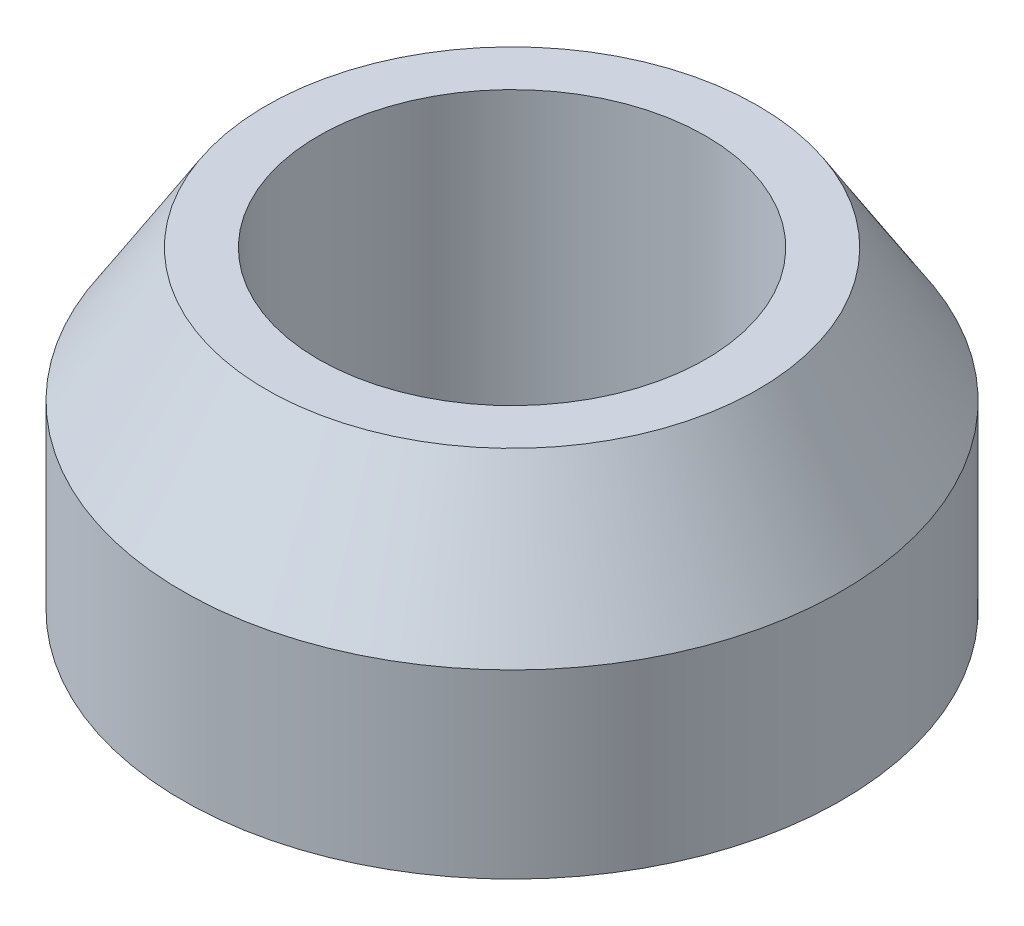
ISO-10303-21;
HEADER;
FILE_DESCRIPTION(('STEP AP214'),'2;1');
FILE_NAME('part.step','',(''),(''),'','','');
FILE_SCHEMA(('AUTOMOTIVE_DESIGN { 1 0 10303 214 1 1 1 1 }'));
ENDSEC;
DATA;
#1=APPLICATION_CONTEXT('core data for automotive mechanical design processes');
#2=APPLICATION_PROTOCOL_DEFINITION('international standard','automotive_design',2000,#1);
#3=PRODUCT_CONTEXT('',#1,'mechanical');
#4=PRODUCT('Part','Part','',(#3));
#5=PRODUCT_RELATED_PRODUCT_CATEGORY('part','',(#4));
#6=PRODUCT_DEFINITION_FORMATION('','',#4);
#7=PRODUCT_DEFINITION_CONTEXT('part definition',#1,'design');
#8=PRODUCT_DEFINITION('design','',#6,#7);
#9=PRODUCT_DEFINITION_SHAPE('','',#8);
#10=(LENGTH_UNIT() NAMED_UNIT(*) SI_UNIT(.MILLI.,.METRE.));
#11=(NAMED_UNIT(*) PLANE_ANGLE_UNIT() SI_UNIT($,.RADIAN.));
#12=(NAMED_UNIT(*) SI_UNIT($,.STERADIAN.) SOLID_ANGLE_UNIT());
#13=UNCERTAINTY_MEASURE_WITH_UNIT(LENGTH_MEASURE(1.E-05),#10,'distance_accuracy_value','');
#14=(GEOMETRIC_REPRESENTATION_CONTEXT(3) GLOBAL_UNCERTAINTY_ASSIGNED_CONTEXT((#13)) GLOBAL_UNIT_ASSIGNED_CONTEXT((#10,
#11,#12)) REPRESENTATION_CONTEXT('',''));
#15=CARTESIAN_POINT('',(0.,0.,0.));
#16=DIRECTION('',(0.,0.,1.));
#17=DIRECTION('',(1.,0.,0.));
#18=AXIS2_PLACEMENT_3D('',#15,#16,#17);
#19=CARTESIAN_POINT('',(1.85,0.,0.));
#20=DIRECTION('',(0.,-1.,0.));
#21=DIRECTION('',(0.,0.,-1.));
#22=AXIS2_PLACEMENT_3D('',#19,#20,#21);
#23=PLANE('',#22);
#24=CARTESIAN_POINT('',(0.,0.,0.));
#25=DIRECTION('',(0.,-1.,0.));
#26=DIRECTION('',(0.,0.,-1.));
#27=AXIS2_PLACEMENT_3D('',#24,#25,#26);
#28=CIRCLE('',#27,3.15);
#29=CARTESIAN_POINT('',(0.,0.,-3.15));
#30=VERTEX_POINT('',#29);
#31=EDGE_CURVE('E10',#30,#30,#28,.T.);
#32=ORIENTED_EDGE('',*,*,#31,.T.);
#33=EDGE_LOOP('',(#32));
#34=FACE_BOUND('',#33,.T.);
#35=CARTESIAN_POINT('',(0.,0.,0.));
#36=DIRECTION('',(0.,-1.,0.));
#37=DIRECTION('',(0.,0.,-1.));
#38=AXIS2_PLACEMENT_3D('',#35,#36,#37);
#39=CIRCLE('',#38,1.85);
#40=CARTESIAN_POINT('',(0.,0.,-1.85));
#41=VERTEX_POINT('',#40);
#42=EDGE_CURVE('E56',#41,#41,#39,.T.);
#43=ORIENTED_EDGE('',*,*,#42,.F.);
#44=EDGE_LOOP('',(#43));
#45=FACE_BOUND('',#44,.T.);
#46=ADVANCED_FACE('F37',(#34,#45),#23,.T.);
#47=CARTESIAN_POINT('',(0.,0.,0.));
#48=DIRECTION('',(0.,-1.,0.));
#49=DIRECTION('',(0.,0.,-1.));
#50=AXIS2_PLACEMENT_3D('',#47,#48,#49);
#51=CYLINDRICAL_SURFACE('',#50,3.15);
#52=CARTESIAN_POINT('',(0.,1.73114224595505,0.));
#53=DIRECTION('',(0.,-1.,0.));
#54=DIRECTION('',(0.,0.,-1.));
#55=AXIS2_PLACEMENT_3D('',#52,#53,#54);
#56=CIRCLE('',#55,3.15);
#57=CARTESIAN_POINT('',(0.,1.73114224595505,-3.15));
#58=VERTEX_POINT('',#57);
#59=EDGE_CURVE('E43',#58,#58,#56,.T.);
#60=ORIENTED_EDGE('',*,*,#59,.T.);
#61=EDGE_LOOP('',(#60));
#62=FACE_BOUND('',#61,.T.);
#63=ORIENTED_EDGE('',*,*,#31,.F.);
#64=EDGE_LOOP('',(#63));
#65=FACE_BOUND('',#64,.T.);
#66=ADVANCED_FACE('F64',(#62,#65),#51,.T.);
#67=CARTESIAN_POINT('',(0.,1.73114224595505,0.));
#68=DIRECTION('',(0.,-1.,0.));
#69=DIRECTION('',(0.,0.,-1.));
#70=AXIS2_PLACEMENT_3D('',#67,#68,#69);
#71=CONICAL_SURFACE('',#70,3.15,0.562536244543856);
#72=CARTESIAN_POINT('',(0.,3.,0.));
#73=DIRECTION('',(0.,-1.,0.));
#74=DIRECTION('',(0.,0.,-1.));
#75=AXIS2_PLACEMENT_3D('',#72,#73,#74);
#76=CIRCLE('',#75,2.35);
#77=CARTESIAN_POINT('',(0.,3.,-2.35));
#78=VERTEX_POINT('',#77);
#79=EDGE_CURVE('E47',#78,#78,#76,.T.);
#80=ORIENTED_EDGE('',*,*,#79,.T.);
#81=EDGE_LOOP('',(#80));
#82=FACE_BOUND('',#81,.T.);
#83=ORIENTED_EDGE('',*,*,#59,.F.);
#84=EDGE_LOOP('',(#83));
#85=FACE_BOUND('',#84,.T.);
#86=ADVANCED_FACE('F68',(#82,#85),#71,.T.);
#87=CARTESIAN_POINT('',(1.85,3.00000000000005,0.));
#88=DIRECTION('',(0.,1.,0.));
#89=DIRECTION('',(0.,0.,1.));
#90=AXIS2_PLACEMENT_3D('',#87,#88,#89);
#91=PLANE('',#90);
#92=CARTESIAN_POINT('',(0.,3.00000000000009,0.));
#93=DIRECTION('',(0.,-1.,0.));
#94=DIRECTION('',(0.,0.,-1.));
#95=AXIS2_PLACEMENT_3D('',#92,#93,#94);
#96=CIRCLE('',#95,1.85);
#97=CARTESIAN_POINT('',(0.,3.00000000000009,-1.85));
#98=VERTEX_POINT('',#97);
#99=EDGE_CURVE('E51',#98,#98,#96,.T.);
#100=ORIENTED_EDGE('',*,*,#99,.T.);
#101=EDGE_LOOP('',(#100));
#102=FACE_BOUND('',#101,.T.);
#103=ORIENTED_EDGE('',*,*,#79,.F.);
#104=EDGE_LOOP('',(#103));
#105=FACE_BOUND('',#104,.T.);
#106=ADVANCED_FACE('F72',(#102,#105),#91,.T.);
#107=CARTESIAN_POINT('',(0.,0.,0.));
#108=DIRECTION('',(0.,-1.,0.));
#109=DIRECTION('',(0.,0.,-1.));
#110=AXIS2_PLACEMENT_3D('',#107,#108,#109);
#111=CYLINDRICAL_SURFACE('',#110,1.85);
#112=ORIENTED_EDGE('',*,*,#42,.T.);
#113=EDGE_LOOP('',(#112));
#114=FACE_BOUND('',#113,.T.);
#115=ORIENTED_EDGE('',*,*,#99,.F.);
#116=EDGE_LOOP('',(#115));
#117=FACE_BOUND('',#116,.T.);
#118=ADVANCED_FACE('F60',(#114,#117),#111,.F.);
#119=CLOSED_SHELL('',(#46,#66,#86,#106,#118));
#120=MANIFOLD_SOLID_BREP('B2',#119);
#121=ADVANCED_BREP_SHAPE_REPRESENTATION('',(#18,#120),#14);
#122=SHAPE_DEFINITION_REPRESENTATION(#9,#121);
ENDSEC;
END-ISO-10303-21;
